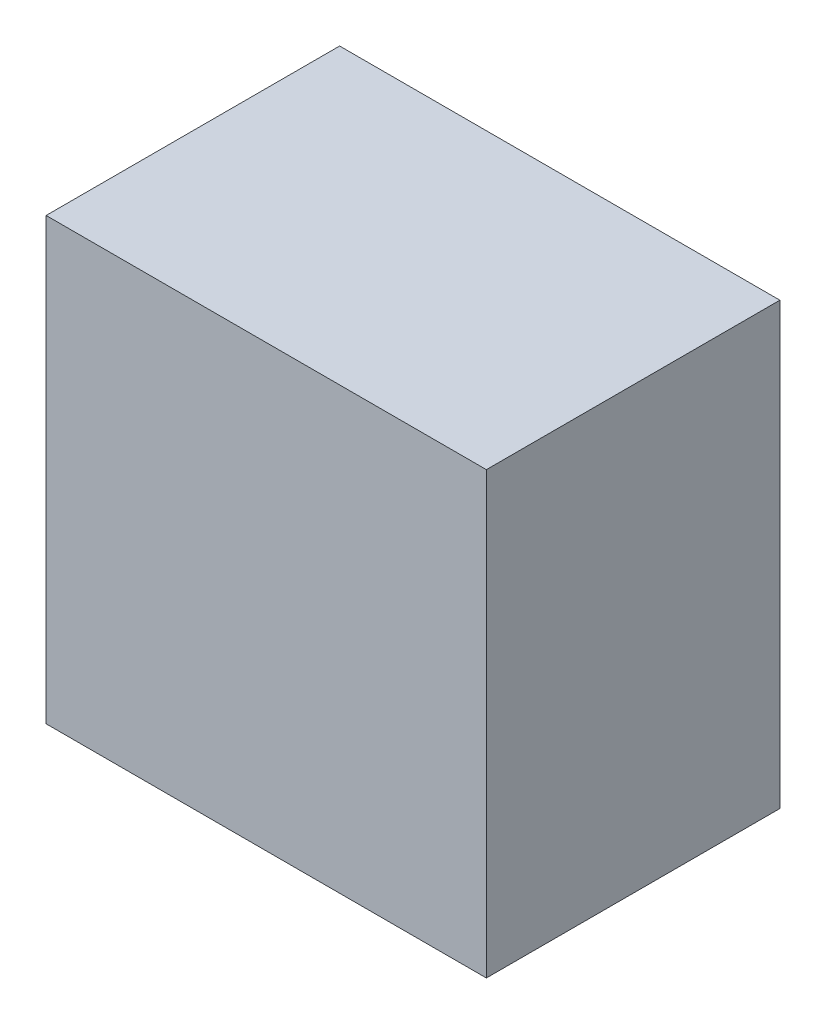
ISO-10303-21;
HEADER;
FILE_DESCRIPTION(('STEP AP214'),'2;1');
FILE_NAME('part.step','',(''),(''),'','','');
FILE_SCHEMA(('AUTOMOTIVE_DESIGN { 1 0 10303 214 1 1 1 1 }'));
ENDSEC;
DATA;
#1=APPLICATION_CONTEXT('core data for automotive mechanical design processes');
#2=APPLICATION_PROTOCOL_DEFINITION('international standard','automotive_design',2000,#1);
#3=PRODUCT_CONTEXT('',#1,'mechanical');
#4=PRODUCT('Part','Part','',(#3));
#5=PRODUCT_RELATED_PRODUCT_CATEGORY('part','',(#4));
#6=PRODUCT_DEFINITION_FORMATION('','',#4);
#7=PRODUCT_DEFINITION_CONTEXT('part definition',#1,'design');
#8=PRODUCT_DEFINITION('design','',#6,#7);
#9=PRODUCT_DEFINITION_SHAPE('','',#8);
#10=(LENGTH_UNIT() NAMED_UNIT(*) SI_UNIT(.MILLI.,.METRE.));
#11=(NAMED_UNIT(*) PLANE_ANGLE_UNIT() SI_UNIT($,.RADIAN.));
#12=(NAMED_UNIT(*) SI_UNIT($,.STERADIAN.) SOLID_ANGLE_UNIT());
#13=UNCERTAINTY_MEASURE_WITH_UNIT(LENGTH_MEASURE(1.E-05),#10,'distance_accuracy_value','');
#14=(GEOMETRIC_REPRESENTATION_CONTEXT(3) GLOBAL_UNCERTAINTY_ASSIGNED_CONTEXT((#13)) GLOBAL_UNIT_ASSIGNED_CONTEXT((#10,
#11,#12)) REPRESENTATION_CONTEXT('',''));
#15=CARTESIAN_POINT('',(0.,0.,0.));
#16=DIRECTION('',(0.,0.,1.));
#17=DIRECTION('',(1.,0.,0.));
#18=AXIS2_PLACEMENT_3D('',#15,#16,#17);
#19=CARTESIAN_POINT('',(0.,38.1,0.));
#20=DIRECTION('',(1.,0.,0.));
#21=DIRECTION('',(0.,0.,-1.));
#22=AXIS2_PLACEMENT_3D('',#19,#20,#21);
#23=PLANE('',#22);
#24=DIRECTION('',(0.,0.,1.));
#25=VECTOR('',#24,1.);
#26=CARTESIAN_POINT('',(0.,0.,0.));
#27=LINE('',#26,#25);
#28=CARTESIAN_POINT('',(0.,0.,-25.4));
#29=VERTEX_POINT('',#28);
#30=CARTESIAN_POINT('',(0.,0.,0.));
#31=VERTEX_POINT('',#30);
#32=EDGE_CURVE('E96',#29,#31,#27,.T.);
#33=ORIENTED_EDGE('',*,*,#32,.T.);
#34=DIRECTION('',(0.,-1.,0.));
#35=VECTOR('',#34,1.);
#36=CARTESIAN_POINT('',(0.,38.1,0.));
#37=LINE('',#36,#35);
#38=CARTESIAN_POINT('',(0.,38.1,0.));
#39=VERTEX_POINT('',#38);
#40=EDGE_CURVE('E11',#39,#31,#37,.T.);
#41=ORIENTED_EDGE('',*,*,#40,.F.);
#42=DIRECTION('',(0.,0.,1.));
#43=VECTOR('',#42,1.);
#44=CARTESIAN_POINT('',(0.,38.1,0.));
#45=LINE('',#44,#43);
#46=CARTESIAN_POINT('',(0.,38.1,-25.4));
#47=VERTEX_POINT('',#46);
#48=EDGE_CURVE('E84',#47,#39,#45,.T.);
#49=ORIENTED_EDGE('',*,*,#48,.F.);
#50=DIRECTION('',(0.,-1.,0.));
#51=VECTOR('',#50,1.);
#52=CARTESIAN_POINT('',(0.,38.1,-25.4));
#53=LINE('',#52,#51);
#54=EDGE_CURVE('E92',#47,#29,#53,.T.);
#55=ORIENTED_EDGE('',*,*,#54,.T.);
#56=EDGE_LOOP('',(#33,#41,#49,#55));
#57=FACE_BOUND('',#56,.T.);
#58=ADVANCED_FACE('F33',(#57),#23,.F.);
#59=CARTESIAN_POINT('',(0.,38.1,0.));
#60=DIRECTION('',(0.,0.,-1.));
#61=DIRECTION('',(-1.,0.,0.));
#62=AXIS2_PLACEMENT_3D('',#59,#60,#61);
#63=PLANE('',#62);
#64=DIRECTION('',(1.,0.,0.));
#65=VECTOR('',#64,1.);
#66=CARTESIAN_POINT('',(0.,0.,0.));
#67=LINE('',#66,#65);
#68=CARTESIAN_POINT('',(38.1,0.,0.));
#69=VERTEX_POINT('',#68);
#70=EDGE_CURVE('E88',#31,#69,#67,.T.);
#71=ORIENTED_EDGE('',*,*,#70,.T.);
#72=DIRECTION('',(0.,-1.,0.));
#73=VECTOR('',#72,1.);
#74=CARTESIAN_POINT('',(38.1,38.1,0.));
#75=LINE('',#74,#73);
#76=CARTESIAN_POINT('',(38.1,38.1,0.));
#77=VERTEX_POINT('',#76);
#78=EDGE_CURVE('E41',#77,#69,#75,.T.);
#79=ORIENTED_EDGE('',*,*,#78,.F.);
#80=DIRECTION('',(1.,0.,0.));
#81=VECTOR('',#80,1.);
#82=CARTESIAN_POINT('',(0.,38.1,0.));
#83=LINE('',#82,#81);
#84=EDGE_CURVE('E79',#39,#77,#83,.T.);
#85=ORIENTED_EDGE('',*,*,#84,.F.);
#86=ORIENTED_EDGE('',*,*,#40,.T.);
#87=EDGE_LOOP('',(#71,#79,#85,#86));
#88=FACE_BOUND('',#87,.T.);
#89=ADVANCED_FACE('F87',(#88),#63,.F.);
#90=CARTESIAN_POINT('',(38.1,38.1,0.));
#91=DIRECTION('',(-1.,0.,0.));
#92=DIRECTION('',(0.,0.,1.));
#93=AXIS2_PLACEMENT_3D('',#90,#91,#92);
#94=PLANE('',#93);
#95=DIRECTION('',(0.,0.,-1.));
#96=VECTOR('',#95,1.);
#97=CARTESIAN_POINT('',(38.1,0.,0.));
#98=LINE('',#97,#96);
#99=CARTESIAN_POINT('',(38.1,0.,-25.4));
#100=VERTEX_POINT('',#99);
#101=EDGE_CURVE('E66',#69,#100,#98,.T.);
#102=ORIENTED_EDGE('',*,*,#101,.T.);
#103=DIRECTION('',(0.,-1.,0.));
#104=VECTOR('',#103,1.);
#105=CARTESIAN_POINT('',(38.1,38.1,-25.4));
#106=LINE('',#105,#104);
#107=CARTESIAN_POINT('',(38.1,38.1,-25.4));
#108=VERTEX_POINT('',#107);
#109=EDGE_CURVE('E89',#108,#100,#106,.T.);
#110=ORIENTED_EDGE('',*,*,#109,.F.);
#111=DIRECTION('',(0.,0.,-1.));
#112=VECTOR('',#111,1.);
#113=CARTESIAN_POINT('',(38.1,38.1,0.));
#114=LINE('',#113,#112);
#115=EDGE_CURVE('E82',#77,#108,#114,.T.);
#116=ORIENTED_EDGE('',*,*,#115,.F.);
#117=ORIENTED_EDGE('',*,*,#78,.T.);
#118=EDGE_LOOP('',(#102,#110,#116,#117));
#119=FACE_BOUND('',#118,.T.);
#120=ADVANCED_FACE('F90',(#119),#94,.F.);
#121=CARTESIAN_POINT('',(0.,38.1,-25.4));
#122=DIRECTION('',(0.,0.,1.));
#123=DIRECTION('',(1.,0.,0.));
#124=AXIS2_PLACEMENT_3D('',#121,#122,#123);
#125=PLANE('',#124);
#126=DIRECTION('',(-1.,0.,0.));
#127=VECTOR('',#126,1.);
#128=CARTESIAN_POINT('',(0.,0.,-25.4));
#129=LINE('',#128,#127);
#130=EDGE_CURVE('E72',#100,#29,#129,.T.);
#131=ORIENTED_EDGE('',*,*,#130,.T.);
#132=ORIENTED_EDGE('',*,*,#54,.F.);
#133=DIRECTION('',(-1.,0.,0.));
#134=VECTOR('',#133,1.);
#135=CARTESIAN_POINT('',(0.,38.1,-25.4));
#136=LINE('',#135,#134);
#137=EDGE_CURVE('E49',#108,#47,#136,.T.);
#138=ORIENTED_EDGE('',*,*,#137,.F.);
#139=ORIENTED_EDGE('',*,*,#109,.T.);
#140=EDGE_LOOP('',(#131,#132,#138,#139));
#141=FACE_BOUND('',#140,.T.);
#142=ADVANCED_FACE('F103',(#141),#125,.F.);
#143=CARTESIAN_POINT('',(0.,38.1,0.));
#144=DIRECTION('',(0.,-1.,0.));
#145=DIRECTION('',(0.,0.,-1.));
#146=AXIS2_PLACEMENT_3D('',#143,#144,#145);
#147=PLANE('',#146);
#148=ORIENTED_EDGE('',*,*,#48,.T.);
#149=ORIENTED_EDGE('',*,*,#84,.T.);
#150=ORIENTED_EDGE('',*,*,#115,.T.);
#151=ORIENTED_EDGE('',*,*,#137,.T.);
#152=EDGE_LOOP('',(#148,#149,#150,#151));
#153=FACE_BOUND('',#152,.T.);
#154=ADVANCED_FACE('F80',(#153),#147,.F.);
#155=CARTESIAN_POINT('',(0.,0.,0.));
#156=DIRECTION('',(0.,-1.,0.));
#157=DIRECTION('',(0.,0.,-1.));
#158=AXIS2_PLACEMENT_3D('',#155,#156,#157);
#159=PLANE('',#158);
#160=ORIENTED_EDGE('',*,*,#32,.F.);
#161=ORIENTED_EDGE('',*,*,#130,.F.);
#162=ORIENTED_EDGE('',*,*,#101,.F.);
#163=ORIENTED_EDGE('',*,*,#70,.F.);
#164=EDGE_LOOP('',(#160,#161,#162,#163));
#165=FACE_BOUND('',#164,.T.);
#166=ADVANCED_FACE('F106',(#165),#159,.T.);
#167=CLOSED_SHELL('',(#58,#89,#120,#142,#154,#166));
#168=MANIFOLD_SOLID_BREP('B2',#167);
#169=ADVANCED_BREP_SHAPE_REPRESENTATION('',(#18,#168),#14);
#170=SHAPE_DEFINITION_REPRESENTATION(#9,#169);
ENDSEC;
END-ISO-10303-21;
